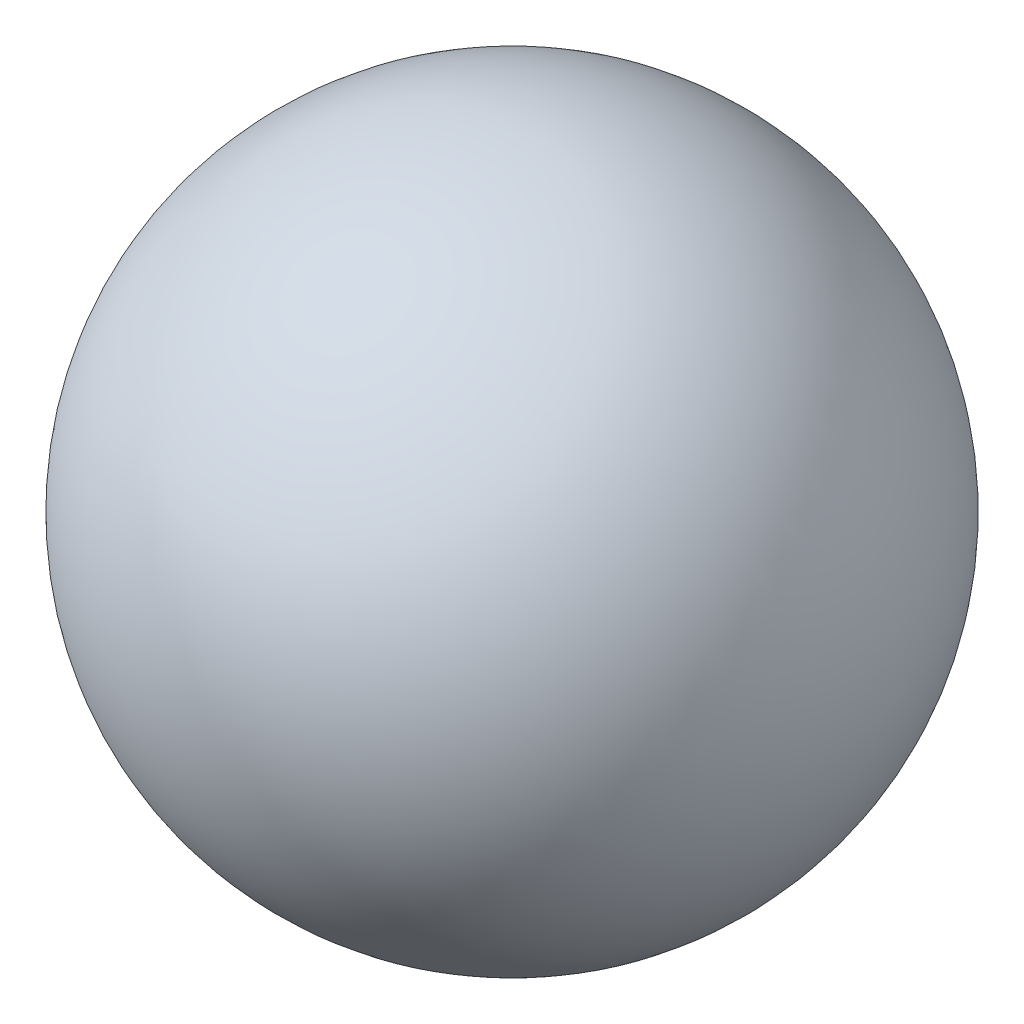
ISO-10303-21;
HEADER;
FILE_DESCRIPTION(('STEP AP214'),'2;1');
FILE_NAME('part.step','',(''),(''),'','','');
FILE_SCHEMA(('AUTOMOTIVE_DESIGN { 1 0 10303 214 1 1 1 1 }'));
ENDSEC;
DATA;
#1=APPLICATION_CONTEXT('core data for automotive mechanical design processes');
#2=APPLICATION_PROTOCOL_DEFINITION('international standard','automotive_design',2000,#1);
#3=PRODUCT_CONTEXT('',#1,'mechanical');
#4=PRODUCT('Part','Part','',(#3));
#5=PRODUCT_RELATED_PRODUCT_CATEGORY('part','',(#4));
#6=PRODUCT_DEFINITION_FORMATION('','',#4);
#7=PRODUCT_DEFINITION_CONTEXT('part definition',#1,'design');
#8=PRODUCT_DEFINITION('design','',#6,#7);
#9=PRODUCT_DEFINITION_SHAPE('','',#8);
#10=(LENGTH_UNIT() NAMED_UNIT(*) SI_UNIT(.MILLI.,.METRE.));
#11=(NAMED_UNIT(*) PLANE_ANGLE_UNIT() SI_UNIT($,.RADIAN.));
#12=(NAMED_UNIT(*) SI_UNIT($,.STERADIAN.) SOLID_ANGLE_UNIT());
#13=UNCERTAINTY_MEASURE_WITH_UNIT(LENGTH_MEASURE(1.E-05),#10,'distance_accuracy_value','');
#14=(GEOMETRIC_REPRESENTATION_CONTEXT(3) GLOBAL_UNCERTAINTY_ASSIGNED_CONTEXT((#13)) GLOBAL_UNIT_ASSIGNED_CONTEXT((#10,
#11,#12)) REPRESENTATION_CONTEXT('',''));
#15=CARTESIAN_POINT('',(0.,0.,0.));
#16=DIRECTION('',(0.,0.,1.));
#17=DIRECTION('',(1.,0.,0.));
#18=AXIS2_PLACEMENT_3D('',#15,#16,#17);
#19=CARTESIAN_POINT('',(121.253630277684,114.595584396519,22.5449391064666));
#20=DIRECTION('',(0.,1.,0.));
#21=DIRECTION('',(1.,0.,0.));
#22=AXIS2_PLACEMENT_3D('',#19,#20,#21);
#23=SPHERICAL_SURFACE('',#22,20.1231248708449);
#24=CARTESIAN_POINT('',(121.253630277684,134.718709267364,22.5449391064666));
#25=VERTEX_POINT('',#24);
#26=VERTEX_LOOP('',#25);
#27=FACE_BOUND('',#26,.T.);
#28=ADVANCED_FACE('F39',(#27),#23,.T.);
#29=CLOSED_SHELL('',(#28));
#30=MANIFOLD_SOLID_BREP('B2',#29);
#31=ADVANCED_BREP_SHAPE_REPRESENTATION('',(#18,#30),#14);
#32=SHAPE_DEFINITION_REPRESENTATION(#9,#31);
ENDSEC;
END-ISO-10303-21;
